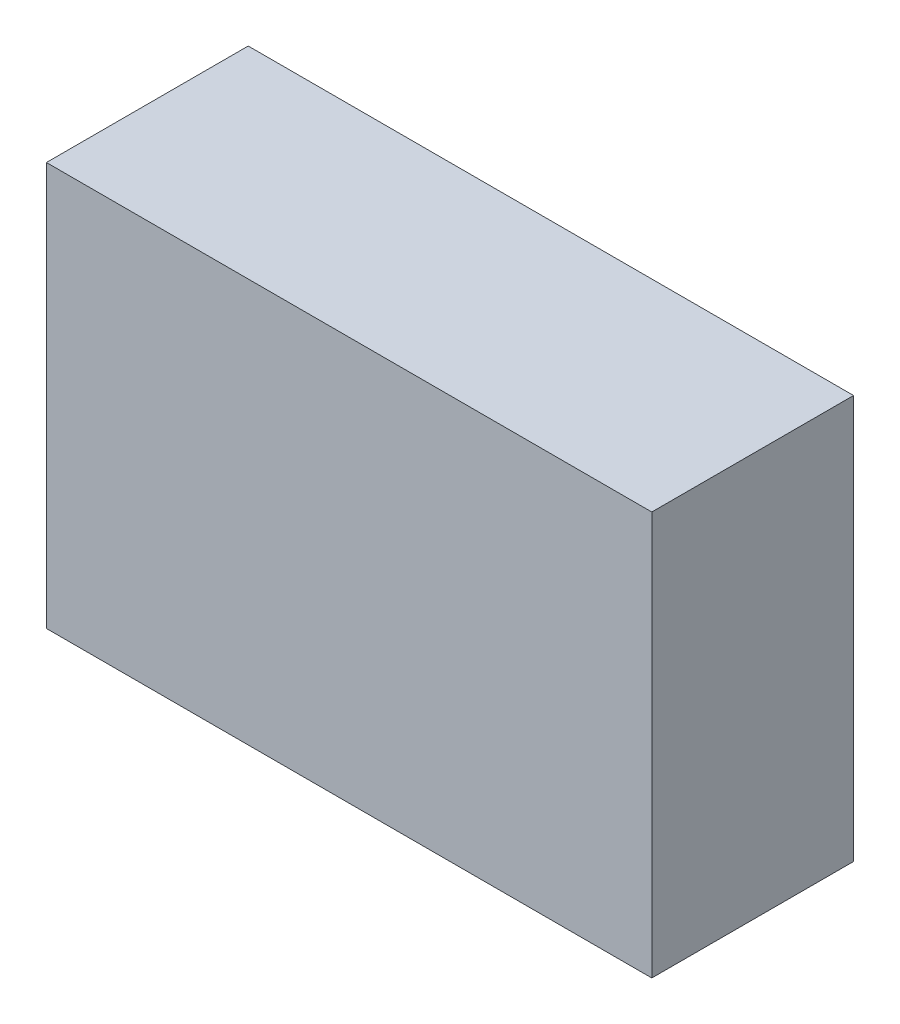
ISO-10303-21;
HEADER;
FILE_DESCRIPTION(('STEP AP214'),'2;1');
FILE_NAME('part.step','',(''),(''),'','','');
FILE_SCHEMA(('AUTOMOTIVE_DESIGN { 1 0 10303 214 1 1 1 1 }'));
ENDSEC;
DATA;
#1=APPLICATION_CONTEXT('core data for automotive mechanical design processes');
#2=APPLICATION_PROTOCOL_DEFINITION('international standard','automotive_design',2000,#1);
#3=PRODUCT_CONTEXT('',#1,'mechanical');
#4=PRODUCT('Part','Part','',(#3));
#5=PRODUCT_RELATED_PRODUCT_CATEGORY('part','',(#4));
#6=PRODUCT_DEFINITION_FORMATION('','',#4);
#7=PRODUCT_DEFINITION_CONTEXT('part definition',#1,'design');
#8=PRODUCT_DEFINITION('design','',#6,#7);
#9=PRODUCT_DEFINITION_SHAPE('','',#8);
#10=(LENGTH_UNIT() NAMED_UNIT(*) SI_UNIT(.MILLI.,.METRE.));
#11=(NAMED_UNIT(*) PLANE_ANGLE_UNIT() SI_UNIT($,.RADIAN.));
#12=(NAMED_UNIT(*) SI_UNIT($,.STERADIAN.) SOLID_ANGLE_UNIT());
#13=UNCERTAINTY_MEASURE_WITH_UNIT(LENGTH_MEASURE(1.E-05),#10,'distance_accuracy_value','');
#14=(GEOMETRIC_REPRESENTATION_CONTEXT(3) GLOBAL_UNCERTAINTY_ASSIGNED_CONTEXT((#13)) GLOBAL_UNIT_ASSIGNED_CONTEXT((#10,
#11,#12)) REPRESENTATION_CONTEXT('',''));
#15=CARTESIAN_POINT('',(0.,0.,0.));
#16=DIRECTION('',(0.,0.,1.));
#17=DIRECTION('',(1.,0.,0.));
#18=AXIS2_PLACEMENT_3D('',#15,#16,#17);
#19=CARTESIAN_POINT('',(0.,101.6,0.));
#20=DIRECTION('',(1.,0.,0.));
#21=DIRECTION('',(0.,0.,-1.));
#22=AXIS2_PLACEMENT_3D('',#19,#20,#21);
#23=PLANE('',#22);
#24=DIRECTION('',(0.,0.,1.));
#25=VECTOR('',#24,1.);
#26=CARTESIAN_POINT('',(0.,0.,0.));
#27=LINE('',#26,#25);
#28=CARTESIAN_POINT('',(0.,0.,-50.8));
#29=VERTEX_POINT('',#28);
#30=CARTESIAN_POINT('',(0.,0.,0.));
#31=VERTEX_POINT('',#30);
#32=EDGE_CURVE('E153',#29,#31,#27,.T.);
#33=ORIENTED_EDGE('',*,*,#32,.T.);
#34=DIRECTION('',(0.,-1.,0.));
#35=VECTOR('',#34,1.);
#36=CARTESIAN_POINT('',(0.,101.6,0.));
#37=LINE('',#36,#35);
#38=CARTESIAN_POINT('',(0.,101.6,0.));
#39=VERTEX_POINT('',#38);
#40=EDGE_CURVE('E12',#39,#31,#37,.T.);
#41=ORIENTED_EDGE('',*,*,#40,.F.);
#42=DIRECTION('',(0.,0.,1.));
#43=VECTOR('',#42,1.);
#44=CARTESIAN_POINT('',(0.,101.6,0.));
#45=LINE('',#44,#43);
#46=CARTESIAN_POINT('',(0.,101.6,-50.8));
#47=VERTEX_POINT('',#46);
#48=EDGE_CURVE('E138',#47,#39,#45,.T.);
#49=ORIENTED_EDGE('',*,*,#48,.F.);
#50=DIRECTION('',(0.,-1.,0.));
#51=VECTOR('',#50,1.);
#52=CARTESIAN_POINT('',(0.,101.6,-50.8));
#53=LINE('',#52,#51);
#54=EDGE_CURVE('E148',#47,#29,#53,.T.);
#55=ORIENTED_EDGE('',*,*,#54,.T.);
#56=EDGE_LOOP('',(#33,#41,#49,#55));
#57=FACE_BOUND('',#56,.T.);
#58=ADVANCED_FACE('F86',(#57),#23,.F.);
#59=CARTESIAN_POINT('',(0.,101.6,0.));
#60=DIRECTION('',(0.,0.,-1.));
#61=DIRECTION('',(-1.,0.,0.));
#62=AXIS2_PLACEMENT_3D('',#59,#60,#61);
#63=PLANE('',#62);
#64=DIRECTION('',(1.,0.,0.));
#65=VECTOR('',#64,1.);
#66=CARTESIAN_POINT('',(0.,0.,0.));
#67=LINE('',#66,#65);
#68=CARTESIAN_POINT('',(152.4,0.,0.));
#69=VERTEX_POINT('',#68);
#70=EDGE_CURVE('E142',#31,#69,#67,.T.);
#71=ORIENTED_EDGE('',*,*,#70,.T.);
#72=DIRECTION('',(0.,-1.,0.));
#73=VECTOR('',#72,1.);
#74=CARTESIAN_POINT('',(152.4,101.6,0.));
#75=LINE('',#74,#73);
#76=CARTESIAN_POINT('',(152.4,101.6,0.));
#77=VERTEX_POINT('',#76);
#78=EDGE_CURVE('E94',#77,#69,#75,.T.);
#79=ORIENTED_EDGE('',*,*,#78,.F.);
#80=DIRECTION('',(1.,0.,0.));
#81=VECTOR('',#80,1.);
#82=CARTESIAN_POINT('',(0.,101.6,0.));
#83=LINE('',#82,#81);
#84=EDGE_CURVE('E133',#39,#77,#83,.T.);
#85=ORIENTED_EDGE('',*,*,#84,.F.);
#86=ORIENTED_EDGE('',*,*,#40,.T.);
#87=EDGE_LOOP('',(#71,#79,#85,#86));
#88=FACE_BOUND('',#87,.T.);
#89=ADVANCED_FACE('F145',(#88),#63,.F.);
#90=CARTESIAN_POINT('',(152.4,101.6,0.));
#91=DIRECTION('',(-1.,0.,0.));
#92=DIRECTION('',(0.,0.,1.));
#93=AXIS2_PLACEMENT_3D('',#90,#91,#92);
#94=PLANE('',#93);
#95=DIRECTION('',(0.,0.,-1.));
#96=VECTOR('',#95,1.);
#97=CARTESIAN_POINT('',(152.4,0.,0.));
#98=LINE('',#97,#96);
#99=CARTESIAN_POINT('',(152.4,0.,-50.8));
#100=VERTEX_POINT('',#99);
#101=EDGE_CURVE('E120',#69,#100,#98,.T.);
#102=ORIENTED_EDGE('',*,*,#101,.T.);
#103=DIRECTION('',(0.,-1.,0.));
#104=VECTOR('',#103,1.);
#105=CARTESIAN_POINT('',(152.4,101.6,-50.8));
#106=LINE('',#105,#104);
#107=CARTESIAN_POINT('',(152.4,101.6,-50.8));
#108=VERTEX_POINT('',#107);
#109=EDGE_CURVE('E144',#108,#100,#106,.T.);
#110=ORIENTED_EDGE('',*,*,#109,.F.);
#111=DIRECTION('',(0.,0.,-1.));
#112=VECTOR('',#111,1.);
#113=CARTESIAN_POINT('',(152.4,101.6,0.));
#114=LINE('',#113,#112);
#115=EDGE_CURVE('E136',#77,#108,#114,.T.);
#116=ORIENTED_EDGE('',*,*,#115,.F.);
#117=ORIENTED_EDGE('',*,*,#78,.T.);
#118=EDGE_LOOP('',(#102,#110,#116,#117));
#119=FACE_BOUND('',#118,.T.);
#120=ADVANCED_FACE('F147',(#119),#94,.F.);
#121=CARTESIAN_POINT('',(0.,101.6,-50.8));
#122=DIRECTION('',(0.,0.,1.));
#123=DIRECTION('',(1.,0.,0.));
#124=AXIS2_PLACEMENT_3D('',#121,#122,#123);
#125=PLANE('',#124);
#126=DIRECTION('',(-1.,0.,0.));
#127=VECTOR('',#126,1.);
#128=CARTESIAN_POINT('',(0.,0.,-50.8));
#129=LINE('',#128,#127);
#130=EDGE_CURVE('E128',#100,#29,#129,.T.);
#131=ORIENTED_EDGE('',*,*,#130,.T.);
#132=ORIENTED_EDGE('',*,*,#54,.F.);
#133=DIRECTION('',(-1.,0.,0.));
#134=VECTOR('',#133,1.);
#135=CARTESIAN_POINT('',(0.,101.6,-50.8));
#136=LINE('',#135,#134);
#137=EDGE_CURVE('E104',#108,#47,#136,.T.);
#138=ORIENTED_EDGE('',*,*,#137,.F.);
#139=ORIENTED_EDGE('',*,*,#109,.T.);
#140=EDGE_LOOP('',(#131,#132,#138,#139));
#141=FACE_BOUND('',#140,.T.);
#142=ADVANCED_FACE('F167',(#141),#125,.F.);
#143=CARTESIAN_POINT('',(0.,101.6,0.));
#144=DIRECTION('',(0.,-1.,0.));
#145=DIRECTION('',(0.,0.,-1.));
#146=AXIS2_PLACEMENT_3D('',#143,#144,#145);
#147=PLANE('',#146);
#148=ORIENTED_EDGE('',*,*,#48,.T.);
#149=ORIENTED_EDGE('',*,*,#84,.T.);
#150=ORIENTED_EDGE('',*,*,#115,.T.);
#151=ORIENTED_EDGE('',*,*,#137,.T.);
#152=EDGE_LOOP('',(#148,#149,#150,#151));
#153=FACE_BOUND('',#152,.T.);
#154=ADVANCED_FACE('F132',(#153),#147,.F.);
#155=CARTESIAN_POINT('',(0.,0.,0.));
#156=DIRECTION('',(0.,-1.,0.));
#157=DIRECTION('',(0.,0.,-1.));
#158=AXIS2_PLACEMENT_3D('',#155,#156,#157);
#159=PLANE('',#158);
#160=ORIENTED_EDGE('',*,*,#32,.F.);
#161=ORIENTED_EDGE('',*,*,#130,.F.);
#162=ORIENTED_EDGE('',*,*,#101,.F.);
#163=ORIENTED_EDGE('',*,*,#70,.F.);
#164=EDGE_LOOP('',(#160,#161,#162,#163));
#165=FACE_BOUND('',#164,.T.);
#166=ADVANCED_FACE('F169',(#165),#159,.T.);
#167=CLOSED_SHELL('',(#58,#89,#120,#142,#154,#166));
#168=MANIFOLD_SOLID_BREP('B2',#167);
#169=ADVANCED_BREP_SHAPE_REPRESENTATION('',(#18,#168),#14);
#170=SHAPE_DEFINITION_REPRESENTATION(#9,#169);
ENDSEC;
END-ISO-10303-21;
